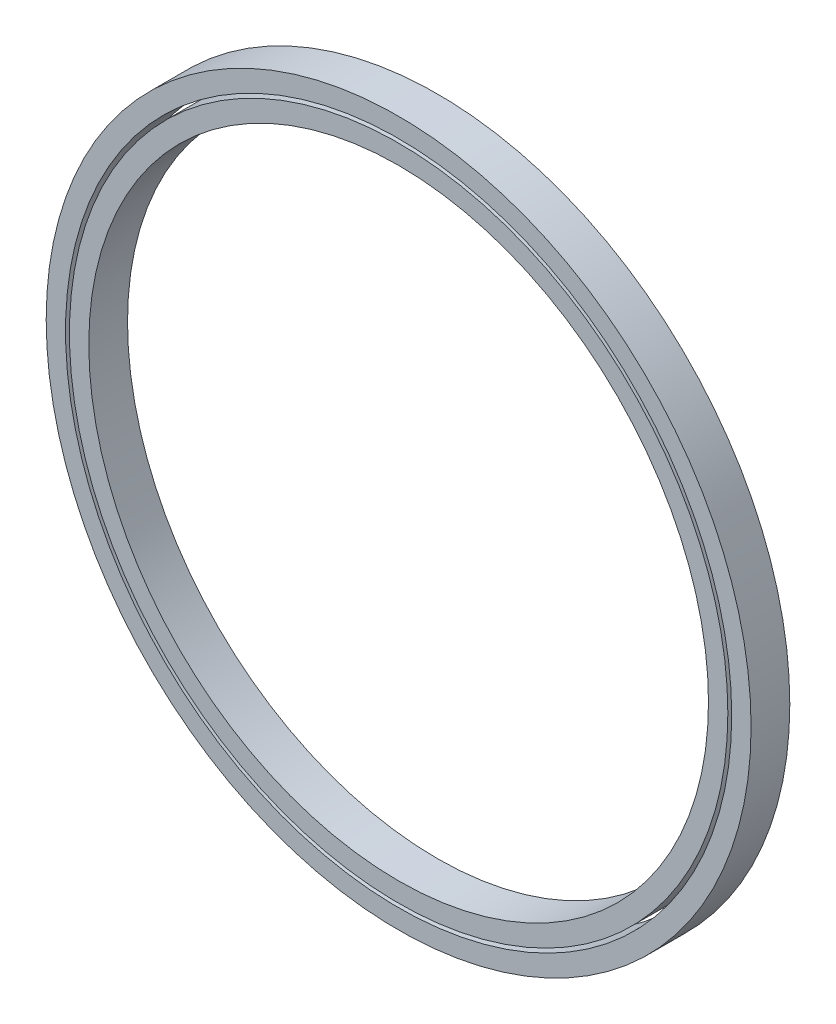
ISO-10303-21;
HEADER;
FILE_DESCRIPTION(('STEP AP214'),'2;1');
FILE_NAME('part.step','',(''),(''),'','','');
FILE_SCHEMA(('AUTOMOTIVE_DESIGN { 1 0 10303 214 1 1 1 1 }'));
ENDSEC;
DATA;
#1=APPLICATION_CONTEXT('core data for automotive mechanical design processes');
#2=APPLICATION_PROTOCOL_DEFINITION('international standard','automotive_design',2000,#1);
#3=PRODUCT_CONTEXT('',#1,'mechanical');
#4=PRODUCT('Part','Part','',(#3));
#5=PRODUCT_RELATED_PRODUCT_CATEGORY('part','',(#4));
#6=PRODUCT_DEFINITION_FORMATION('','',#4);
#7=PRODUCT_DEFINITION_CONTEXT('part definition',#1,'design');
#8=PRODUCT_DEFINITION('design','',#6,#7);
#9=PRODUCT_DEFINITION_SHAPE('','',#8);
#10=(LENGTH_UNIT() NAMED_UNIT(*) SI_UNIT(.MILLI.,.METRE.));
#11=(NAMED_UNIT(*) PLANE_ANGLE_UNIT() SI_UNIT($,.RADIAN.));
#12=(NAMED_UNIT(*) SI_UNIT($,.STERADIAN.) SOLID_ANGLE_UNIT());
#13=UNCERTAINTY_MEASURE_WITH_UNIT(LENGTH_MEASURE(1.E-05),#10,'distance_accuracy_value','');
#14=(GEOMETRIC_REPRESENTATION_CONTEXT(3) GLOBAL_UNCERTAINTY_ASSIGNED_CONTEXT((#13)) GLOBAL_UNIT_ASSIGNED_CONTEXT((#10,
#11,#12)) REPRESENTATION_CONTEXT('',''));
#15=CARTESIAN_POINT('',(0.,0.,0.));
#16=DIRECTION('',(0.,0.,1.));
#17=DIRECTION('',(1.,0.,0.));
#18=AXIS2_PLACEMENT_3D('',#15,#16,#17);
#19=CARTESIAN_POINT('',(0.,0.,2.5));
#20=DIRECTION('',(0.,0.,-1.));
#21=DIRECTION('',(-1.,0.,0.));
#22=AXIS2_PLACEMENT_3D('',#19,#20,#21);
#23=CYLINDRICAL_SURFACE('',#22,43.);
#24=CARTESIAN_POINT('',(0.,0.,2.5));
#25=DIRECTION('',(0.,0.,1.));
#26=DIRECTION('',(1.,0.,0.));
#27=AXIS2_PLACEMENT_3D('',#24,#25,#26);
#28=CIRCLE('',#27,43.);
#29=CARTESIAN_POINT('',(43.,0.,2.5));
#30=VERTEX_POINT('',#29);
#31=EDGE_CURVE('E60',#30,#30,#28,.T.);
#32=ORIENTED_EDGE('',*,*,#31,.T.);
#33=EDGE_LOOP('',(#32));
#34=FACE_BOUND('',#33,.T.);
#35=CARTESIAN_POINT('',(0.,0.,-2.5));
#36=DIRECTION('',(0.,0.,1.));
#37=DIRECTION('',(1.,0.,0.));
#38=AXIS2_PLACEMENT_3D('',#35,#36,#37);
#39=CIRCLE('',#38,43.);
#40=CARTESIAN_POINT('',(43.,0.,-2.5));
#41=VERTEX_POINT('',#40);
#42=EDGE_CURVE('E66',#41,#41,#39,.T.);
#43=ORIENTED_EDGE('',*,*,#42,.F.);
#44=EDGE_LOOP('',(#43));
#45=FACE_BOUND('',#44,.T.);
#46=ADVANCED_FACE('F53',(#34,#45),#23,.F.);
#47=CARTESIAN_POINT('',(0.,0.,2.5));
#48=DIRECTION('',(0.,0.,-1.));
#49=DIRECTION('',(-1.,0.,0.));
#50=AXIS2_PLACEMENT_3D('',#47,#48,#49);
#51=CYLINDRICAL_SURFACE('',#50,45.5);
#52=CARTESIAN_POINT('',(0.,0.,2.5));
#53=DIRECTION('',(0.,0.,1.));
#54=DIRECTION('',(1.,0.,0.));
#55=AXIS2_PLACEMENT_3D('',#52,#53,#54);
#56=CIRCLE('',#55,45.5);
#57=CARTESIAN_POINT('',(45.5,0.,2.5));
#58=VERTEX_POINT('',#57);
#59=EDGE_CURVE('E12',#58,#58,#56,.T.);
#60=ORIENTED_EDGE('',*,*,#59,.F.);
#61=EDGE_LOOP('',(#60));
#62=FACE_BOUND('',#61,.T.);
#63=CARTESIAN_POINT('',(0.,0.,-2.5));
#64=DIRECTION('',(0.,0.,1.));
#65=DIRECTION('',(1.,0.,0.));
#66=AXIS2_PLACEMENT_3D('',#63,#64,#65);
#67=CIRCLE('',#66,45.5);
#68=CARTESIAN_POINT('',(45.5,0.,-2.5));
#69=VERTEX_POINT('',#68);
#70=EDGE_CURVE('E56',#69,#69,#67,.T.);
#71=ORIENTED_EDGE('',*,*,#70,.T.);
#72=EDGE_LOOP('',(#71));
#73=FACE_BOUND('',#72,.T.);
#74=ADVANCED_FACE('F73',(#62,#73),#51,.T.);
#75=CARTESIAN_POINT('',(0.,0.,2.5));
#76=DIRECTION('',(0.,0.,1.));
#77=DIRECTION('',(1.,0.,0.));
#78=AXIS2_PLACEMENT_3D('',#75,#76,#77);
#79=PLANE('',#78);
#80=ORIENTED_EDGE('',*,*,#31,.F.);
#81=EDGE_LOOP('',(#80));
#82=FACE_BOUND('',#81,.T.);
#83=ORIENTED_EDGE('',*,*,#59,.T.);
#84=EDGE_LOOP('',(#83));
#85=FACE_BOUND('',#84,.T.);
#86=ADVANCED_FACE('F77',(#82,#85),#79,.T.);
#87=CARTESIAN_POINT('',(0.,0.,-2.5));
#88=DIRECTION('',(0.,0.,1.));
#89=DIRECTION('',(1.,0.,0.));
#90=AXIS2_PLACEMENT_3D('',#87,#88,#89);
#91=PLANE('',#90);
#92=ORIENTED_EDGE('',*,*,#42,.T.);
#93=EDGE_LOOP('',(#92));
#94=FACE_BOUND('',#93,.T.);
#95=ORIENTED_EDGE('',*,*,#70,.F.);
#96=EDGE_LOOP('',(#95));
#97=FACE_BOUND('',#96,.T.);
#98=ADVANCED_FACE('F75',(#94,#97),#91,.F.);
#99=CLOSED_SHELL('',(#46,#74,#86,#98));
#100=MANIFOLD_SOLID_BREP('B2',#99);
#101=CARTESIAN_POINT('',(0.,0.,2.5));
#102=DIRECTION('',(0.,0.,-1.));
#103=DIRECTION('',(-1.,0.,0.));
#104=AXIS2_PLACEMENT_3D('',#101,#102,#103);
#105=CYLINDRICAL_SURFACE('',#104,40.);
#106=CARTESIAN_POINT('',(0.,0.,2.5));
#107=DIRECTION('',(0.,0.,1.));
#108=DIRECTION('',(1.,0.,0.));
#109=AXIS2_PLACEMENT_3D('',#106,#107,#108);
#110=CIRCLE('',#109,40.);
#111=CARTESIAN_POINT('',(40.,0.,2.5));
#112=VERTEX_POINT('',#111);
#113=EDGE_CURVE('E122',#112,#112,#110,.T.);
#114=ORIENTED_EDGE('',*,*,#113,.T.);
#115=EDGE_LOOP('',(#114));
#116=FACE_BOUND('',#115,.T.);
#117=CARTESIAN_POINT('',(0.,0.,-2.5));
#118=DIRECTION('',(0.,0.,1.));
#119=DIRECTION('',(1.,0.,0.));
#120=AXIS2_PLACEMENT_3D('',#117,#118,#119);
#121=CIRCLE('',#120,40.);
#122=CARTESIAN_POINT('',(40.,0.,-2.5));
#123=VERTEX_POINT('',#122);
#124=EDGE_CURVE('E128',#123,#123,#121,.T.);
#125=ORIENTED_EDGE('',*,*,#124,.F.);
#126=EDGE_LOOP('',(#125));
#127=FACE_BOUND('',#126,.T.);
#128=ADVANCED_FACE('F115',(#116,#127),#105,.F.);
#129=CARTESIAN_POINT('',(0.,0.,2.5));
#130=DIRECTION('',(0.,0.,-1.));
#131=DIRECTION('',(-1.,0.,0.));
#132=AXIS2_PLACEMENT_3D('',#129,#130,#131);
#133=CYLINDRICAL_SURFACE('',#132,42.5);
#134=CARTESIAN_POINT('',(0.,0.,2.5));
#135=DIRECTION('',(0.,0.,1.));
#136=DIRECTION('',(1.,0.,0.));
#137=AXIS2_PLACEMENT_3D('',#134,#135,#136);
#138=CIRCLE('',#137,42.5);
#139=CARTESIAN_POINT('',(42.5,0.,2.5));
#140=VERTEX_POINT('',#139);
#141=EDGE_CURVE('E52',#140,#140,#138,.T.);
#142=ORIENTED_EDGE('',*,*,#141,.F.);
#143=EDGE_LOOP('',(#142));
#144=FACE_BOUND('',#143,.T.);
#145=CARTESIAN_POINT('',(0.,0.,-2.5));
#146=DIRECTION('',(0.,0.,1.));
#147=DIRECTION('',(1.,0.,0.));
#148=AXIS2_PLACEMENT_3D('',#145,#146,#147);
#149=CIRCLE('',#148,42.5);
#150=CARTESIAN_POINT('',(42.5,0.,-2.5));
#151=VERTEX_POINT('',#150);
#152=EDGE_CURVE('E118',#151,#151,#149,.T.);
#153=ORIENTED_EDGE('',*,*,#152,.T.);
#154=EDGE_LOOP('',(#153));
#155=FACE_BOUND('',#154,.T.);
#156=ADVANCED_FACE('F135',(#144,#155),#133,.T.);
#157=CARTESIAN_POINT('',(0.,0.,2.5));
#158=DIRECTION('',(0.,0.,1.));
#159=DIRECTION('',(1.,0.,0.));
#160=AXIS2_PLACEMENT_3D('',#157,#158,#159);
#161=PLANE('',#160);
#162=ORIENTED_EDGE('',*,*,#113,.F.);
#163=EDGE_LOOP('',(#162));
#164=FACE_BOUND('',#163,.T.);
#165=ORIENTED_EDGE('',*,*,#141,.T.);
#166=EDGE_LOOP('',(#165));
#167=FACE_BOUND('',#166,.T.);
#168=ADVANCED_FACE('F139',(#164,#167),#161,.T.);
#169=CARTESIAN_POINT('',(0.,0.,-2.5));
#170=DIRECTION('',(0.,0.,1.));
#171=DIRECTION('',(1.,0.,0.));
#172=AXIS2_PLACEMENT_3D('',#169,#170,#171);
#173=PLANE('',#172);
#174=ORIENTED_EDGE('',*,*,#124,.T.);
#175=EDGE_LOOP('',(#174));
#176=FACE_BOUND('',#175,.T.);
#177=ORIENTED_EDGE('',*,*,#152,.F.);
#178=EDGE_LOOP('',(#177));
#179=FACE_BOUND('',#178,.T.);
#180=ADVANCED_FACE('F137',(#176,#179),#173,.F.);
#181=CLOSED_SHELL('',(#128,#156,#168,#180));
#182=MANIFOLD_SOLID_BREP('B7',#181);
#183=ADVANCED_BREP_SHAPE_REPRESENTATION('',(#18,#100,#182),#14);
#184=SHAPE_DEFINITION_REPRESENTATION(#9,#183);
ENDSEC;
END-ISO-10303-21;
